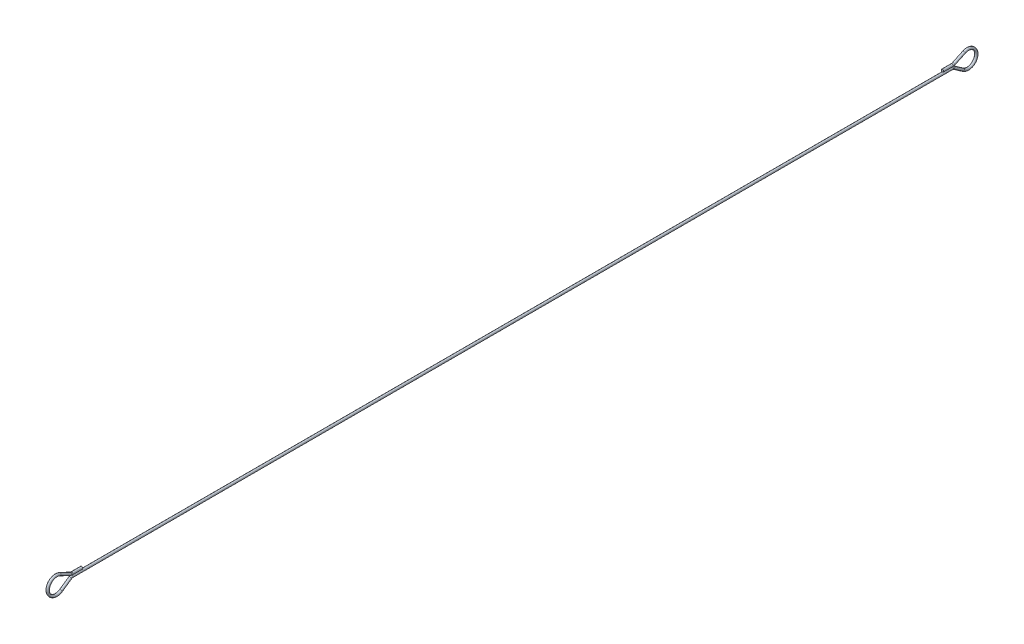
ISO-10303-21;
HEADER;
FILE_DESCRIPTION(('STEP AP214'),'2;1');
FILE_NAME('part.step','',(''),(''),'','','');
FILE_SCHEMA(('AUTOMOTIVE_DESIGN { 1 0 10303 214 1 1 1 1 }'));
ENDSEC;
DATA;
#1=APPLICATION_CONTEXT('core data for automotive mechanical design processes');
#2=APPLICATION_PROTOCOL_DEFINITION('international standard','automotive_design',2000,#1);
#3=PRODUCT_CONTEXT('',#1,'mechanical');
#4=PRODUCT('Part','Part','',(#3));
#5=PRODUCT_RELATED_PRODUCT_CATEGORY('part','',(#4));
#6=PRODUCT_DEFINITION_FORMATION('','',#4);
#7=PRODUCT_DEFINITION_CONTEXT('part definition',#1,'design');
#8=PRODUCT_DEFINITION('design','',#6,#7);
#9=PRODUCT_DEFINITION_SHAPE('','',#8);
#10=(LENGTH_UNIT() NAMED_UNIT(*) SI_UNIT(.MILLI.,.METRE.));
#11=(NAMED_UNIT(*) PLANE_ANGLE_UNIT() SI_UNIT($,.RADIAN.));
#12=(NAMED_UNIT(*) SI_UNIT($,.STERADIAN.) SOLID_ANGLE_UNIT());
#13=UNCERTAINTY_MEASURE_WITH_UNIT(LENGTH_MEASURE(1.E-05),#10,'distance_accuracy_value','');
#14=(GEOMETRIC_REPRESENTATION_CONTEXT(3) GLOBAL_UNCERTAINTY_ASSIGNED_CONTEXT((#13)) GLOBAL_UNIT_ASSIGNED_CONTEXT((#10,
#11,#12)) REPRESENTATION_CONTEXT('',''));
#15=CARTESIAN_POINT('',(0.,0.,0.));
#16=DIRECTION('',(0.,0.,1.));
#17=DIRECTION('',(1.,0.,0.));
#18=AXIS2_PLACEMENT_3D('',#15,#16,#17);
#19=CARTESIAN_POINT('',(0.,3.20000000000001,565.189079713669));
#20=DIRECTION('',(0.,0.,-1.));
#21=DIRECTION('',(1.,0.,0.));
#22=AXIS2_PLACEMENT_3D('',#19,#20,#21);
#23=PLANE('',#22);
#24=CARTESIAN_POINT('',(0.,3.20000000000001,565.189079713669));
#25=DIRECTION('',(0.,0.,-1.));
#26=DIRECTION('',(1.,0.,0.));
#27=AXIS2_PLACEMENT_3D('',#24,#25,#26);
#28=CIRCLE('',#27,1.5875);
#29=CARTESIAN_POINT('',(1.58749999999999,3.20000000000001,565.189079713669));
#30=VERTEX_POINT('',#29);
#31=EDGE_CURVE('E10',#30,#30,#28,.T.);
#32=ORIENTED_EDGE('',*,*,#31,.T.);
#33=EDGE_LOOP('',(#32));
#34=FACE_BOUND('',#33,.T.);
#35=ADVANCED_FACE('F38',(#34),#23,.T.);
#36=CARTESIAN_POINT('',(0.,0.,0.));
#37=DIRECTION('',(0.,0.,1.));
#38=DIRECTION('',(0.,-1.,0.));
#39=AXIS2_PLACEMENT_3D('',#36,#37,#38);
#40=CYLINDRICAL_SURFACE('',#39,1.5875);
#41=CARTESIAN_POINT('',(0.,-1.04083408558608E-13,577.889079713669));
#42=DIRECTION('',(0.,0.,1.));
#43=DIRECTION('',(1.,0.,0.));
#44=AXIS2_PLACEMENT_3D('',#41,#42,#43);
#45=CIRCLE('',#44,1.5875);
#46=CARTESIAN_POINT('',(0.,1.58749999999989,577.889079713669));
#47=VERTEX_POINT('',#46);
#48=EDGE_CURVE('E73',#47,#47,#45,.T.);
#49=ORIENTED_EDGE('',*,*,#48,.F.);
#50=EDGE_LOOP('',(#49));
#51=FACE_BOUND('',#50,.T.);
#52=CARTESIAN_POINT('',(0.,-1.04083408558608E-13,-577.889079713669));
#53=DIRECTION('',(0.,0.,1.));
#54=DIRECTION('',(1.,0.,0.));
#55=AXIS2_PLACEMENT_3D('',#52,#53,#54);
#56=CIRCLE('',#55,1.5875);
#57=CARTESIAN_POINT('',(0.,1.58749999999989,-577.889079713669));
#58=VERTEX_POINT('',#57);
#59=EDGE_CURVE('E101',#58,#58,#56,.F.);
#60=ORIENTED_EDGE('',*,*,#59,.F.);
#61=EDGE_LOOP('',(#60));
#62=FACE_BOUND('',#61,.T.);
#63=ADVANCED_FACE('F110',(#51,#62),#40,.T.);
#64=CARTESIAN_POINT('',(0.,-3.17500000000003,577.889079713669));
#65=DIRECTION('',(1.,0.,0.));
#66=DIRECTION('',(0.,0.,-1.));
#67=AXIS2_PLACEMENT_3D('',#64,#65,#66);
#68=TOROIDAL_SURFACE('',#67,3.17499999999993,1.5875);
#69=CARTESIAN_POINT('',(0.,-0.567642289303425,579.700794583197));
#70=DIRECTION('',(0.,-0.570618856544406,0.821215026991077));
#71=DIRECTION('',(1.,0.,0.));
#72=AXIS2_PLACEMENT_3D('',#69,#70,#71);
#73=CIRCLE('',#72,1.5875);
#74=CARTESIAN_POINT('',(0.,0.736036566044739,580.606652017962));
#75=VERTEX_POINT('',#74);
#76=EDGE_CURVE('E69',#75,#75,#73,.T.);
#77=CARTESIAN_POINT('',(0.,-3.17500000000003,577.889079713669));
#78=DIRECTION('',(1.,0.,0.));
#79=DIRECTION('',(0.,0.,-1.));
#80=AXIS2_PLACEMENT_3D('',#77,#78,#79);
#81=CIRCLE('',#80,4.76249999999993);
#82=EDGE_CURVE('',#47,#75,#81,.T.);
#83=ORIENTED_EDGE('',*,*,#48,.T.);
#84=ORIENTED_EDGE('',*,*,#76,.F.);
#85=ORIENTED_EDGE('',*,*,#82,.T.);
#86=ORIENTED_EDGE('',*,*,#82,.F.);
#87=EDGE_LOOP('',(#83,#85,#84,#86));
#88=FACE_BOUND('',#87,.T.);
#89=ADVANCED_FACE('F112',(#88),#68,.T.);
#90=CARTESIAN_POINT('',(0.,-0.567642289303429,579.700794583197));
#91=DIRECTION('',(0.,-0.57061885654442,0.821215026991067));
#92=DIRECTION('',(0.,-0.821215026991067,-0.57061885654442));
#93=AXIS2_PLACEMENT_3D('',#90,#91,#92);
#94=CYLINDRICAL_SURFACE('',#93,1.5875);
#95=CARTESIAN_POINT('',(0.,-9.17594890499196,592.089573307687));
#96=DIRECTION('',(0.,-0.57061885654442,0.821215026991067));
#97=DIRECTION('',(1.,0.,0.));
#98=AXIS2_PLACEMENT_3D('',#95,#96,#97);
#99=CIRCLE('',#98,1.5875);
#100=CARTESIAN_POINT('',(0.,-10.4796277603402,591.183715872922));
#101=VERTEX_POINT('',#100);
#102=EDGE_CURVE('E65',#101,#101,#99,.T.);
#103=ORIENTED_EDGE('',*,*,#102,.F.);
#104=EDGE_LOOP('',(#103));
#105=FACE_BOUND('',#104,.T.);
#106=ORIENTED_EDGE('',*,*,#76,.T.);
#107=EDGE_LOOP('',(#106));
#108=FACE_BOUND('',#107,.T.);
#109=ADVANCED_FACE('F119',(#105,#108),#94,.T.);
#110=CARTESIAN_POINT('',(0.,0.,598.465454532195));
#111=DIRECTION('',(-1.,0.,0.));
#112=DIRECTION('',(0.,0.,1.));
#113=AXIS2_PLACEMENT_3D('',#110,#111,#112);
#114=TOROIDAL_SURFACE('',#113,11.1736251814736,1.5875);
#115=CARTESIAN_POINT('',(0.,10.1096495644325,593.706790288898));
#116=DIRECTION('',(0.,-0.425883647071573,-0.904777939141432));
#117=DIRECTION('',(1.,0.,0.));
#118=AXIS2_PLACEMENT_3D('',#115,#116,#117);
#119=CIRCLE('',#118,1.5875);
#120=CARTESIAN_POINT('',(0.,11.5459845428194,593.030699999172));
#121=VERTEX_POINT('',#120);
#122=EDGE_CURVE('E59',#121,#121,#119,.T.);
#123=CARTESIAN_POINT('',(0.,0.,598.465454532195));
#124=DIRECTION('',(-1.,0.,0.));
#125=DIRECTION('',(0.,0.,1.));
#126=AXIS2_PLACEMENT_3D('',#123,#124,#125);
#127=CIRCLE('',#126,12.7611251814736);
#128=EDGE_CURVE('',#101,#121,#127,.T.);
#129=ORIENTED_EDGE('',*,*,#102,.T.);
#130=ORIENTED_EDGE('',*,*,#122,.F.);
#131=ORIENTED_EDGE('',*,*,#128,.T.);
#132=ORIENTED_EDGE('',*,*,#128,.F.);
#133=EDGE_LOOP('',(#129,#131,#130,#132));
#134=FACE_BOUND('',#133,.T.);
#135=ADVANCED_FACE('F141',(#134),#114,.T.);
#136=CARTESIAN_POINT('',(0.,10.1096495644325,593.706790288898));
#137=DIRECTION('',(0.,-0.425883647071573,-0.904777939141432));
#138=DIRECTION('',(0.,0.904777939141432,-0.425883647071573));
#139=AXIS2_PLACEMENT_3D('',#136,#137,#138);
#140=CYLINDRICAL_SURFACE('',#139,1.5875);
#141=CARTESIAN_POINT('',(0.,3.68480577500471,580.057388713902));
#142=DIRECTION('',(0.,-0.425883647071573,-0.904777939141432));
#143=DIRECTION('',(1.,0.,0.));
#144=AXIS2_PLACEMENT_3D('',#141,#142,#143);
#145=CIRCLE('',#144,1.5875);
#146=CARTESIAN_POINT('',(0.,2.24847079661767,580.733479003628));
#147=VERTEX_POINT('',#146);
#148=EDGE_CURVE('E52',#147,#147,#145,.T.);
#149=ORIENTED_EDGE('',*,*,#148,.F.);
#150=EDGE_LOOP('',(#149));
#151=FACE_BOUND('',#150,.T.);
#152=ORIENTED_EDGE('',*,*,#122,.T.);
#153=EDGE_LOOP('',(#152));
#154=FACE_BOUND('',#153,.T.);
#155=ADVANCED_FACE('F135',(#151,#154),#140,.T.);
#156=CARTESIAN_POINT('',(0.,8.2913178168322,577.889079713669));
#157=DIRECTION('',(1.,0.,0.));
#158=DIRECTION('',(0.,0.,-1.));
#159=AXIS2_PLACEMENT_3D('',#156,#157,#158);
#160=TOROIDAL_SURFACE('',#159,5.09131781683218,1.5875);
#161=CARTESIAN_POINT('',(0.,3.20000000000002,577.889079713669));
#162=DIRECTION('',(0.,0.,-1.));
#163=DIRECTION('',(1.,0.,0.));
#164=AXIS2_PLACEMENT_3D('',#161,#162,#163);
#165=CIRCLE('',#164,1.5875);
#166=CARTESIAN_POINT('',(0.,1.61250000000002,577.889079713669));
#167=VERTEX_POINT('',#166);
#168=EDGE_CURVE('E45',#167,#167,#165,.T.);
#169=CARTESIAN_POINT('',(0.,8.2913178168322,577.889079713669));
#170=DIRECTION('',(1.,0.,0.));
#171=DIRECTION('',(0.,0.,-1.));
#172=AXIS2_PLACEMENT_3D('',#169,#170,#171);
#173=CIRCLE('',#172,6.67881781683217);
#174=EDGE_CURVE('',#147,#167,#173,.T.);
#175=ORIENTED_EDGE('',*,*,#148,.T.);
#176=ORIENTED_EDGE('',*,*,#168,.F.);
#177=ORIENTED_EDGE('',*,*,#174,.T.);
#178=ORIENTED_EDGE('',*,*,#174,.F.);
#179=EDGE_LOOP('',(#175,#177,#176,#178));
#180=FACE_BOUND('',#179,.T.);
#181=ADVANCED_FACE('F128',(#180),#160,.T.);
#182=CARTESIAN_POINT('',(0.,3.20000000000001,577.889079713669));
#183=DIRECTION('',(0.,0.,-1.));
#184=DIRECTION('',(0.,1.,0.));
#185=AXIS2_PLACEMENT_3D('',#182,#183,#184);
#186=CYLINDRICAL_SURFACE('',#185,1.5875);
#187=ORIENTED_EDGE('',*,*,#31,.F.);
#188=EDGE_LOOP('',(#187));
#189=FACE_BOUND('',#188,.T.);
#190=ORIENTED_EDGE('',*,*,#168,.T.);
#191=EDGE_LOOP('',(#190));
#192=FACE_BOUND('',#191,.T.);
#193=ADVANCED_FACE('F125',(#189,#192),#186,.T.);
#194=CARTESIAN_POINT('',(0.,3.20000000000001,-565.189079713669));
#195=DIRECTION('',(0.,0.,1.));
#196=DIRECTION('',(1.,0.,0.));
#197=AXIS2_PLACEMENT_3D('',#194,#195,#196);
#198=PLANE('',#197);
#199=CARTESIAN_POINT('',(0.,3.20000000000001,-565.189079713669));
#200=DIRECTION('',(0.,0.,-1.));
#201=DIRECTION('',(1.,0.,0.));
#202=AXIS2_PLACEMENT_3D('',#199,#200,#201);
#203=CIRCLE('',#202,1.5875);
#204=CARTESIAN_POINT('',(1.58750000000004,3.20000000000001,-565.189079713669));
#205=VERTEX_POINT('',#204);
#206=EDGE_CURVE('E77',#205,#205,#203,.F.);
#207=ORIENTED_EDGE('',*,*,#206,.T.);
#208=EDGE_LOOP('',(#207));
#209=FACE_BOUND('',#208,.T.);
#210=ADVANCED_FACE('F127',(#209),#198,.T.);
#211=CARTESIAN_POINT('',(0.,-3.17500000000003,-577.889079713669));
#212=DIRECTION('',(-1.,0.,0.));
#213=DIRECTION('',(0.,0.,1.));
#214=AXIS2_PLACEMENT_3D('',#211,#212,#213);
#215=TOROIDAL_SURFACE('',#214,3.17499999999993,1.5875);
#216=CARTESIAN_POINT('',(0.,-0.567642289303425,-579.700794583197));
#217=DIRECTION('',(0.,0.570618856544406,0.821215026991077));
#218=DIRECTION('',(1.,0.,0.));
#219=AXIS2_PLACEMENT_3D('',#216,#217,#218);
#220=CIRCLE('',#219,1.5875);
#221=CARTESIAN_POINT('',(0.,0.736036566044894,-580.606652017961));
#222=VERTEX_POINT('',#221);
#223=EDGE_CURVE('E97',#222,#222,#220,.F.);
#224=CARTESIAN_POINT('',(0.,-3.17500000000003,-577.889079713669));
#225=DIRECTION('',(-1.,0.,0.));
#226=DIRECTION('',(0.,0.,1.));
#227=AXIS2_PLACEMENT_3D('',#224,#225,#226);
#228=CIRCLE('',#227,4.76249999999993);
#229=EDGE_CURVE('',#58,#222,#228,.T.);
#230=ORIENTED_EDGE('',*,*,#59,.T.);
#231=ORIENTED_EDGE('',*,*,#223,.F.);
#232=ORIENTED_EDGE('',*,*,#229,.T.);
#233=ORIENTED_EDGE('',*,*,#229,.F.);
#234=EDGE_LOOP('',(#230,#232,#231,#233));
#235=FACE_BOUND('',#234,.T.);
#236=ADVANCED_FACE('F108',(#235),#215,.T.);
#237=CARTESIAN_POINT('',(0.,-0.567642289303429,-579.700794583197));
#238=DIRECTION('',(0.,-0.57061885654442,-0.821215026991067));
#239=DIRECTION('',(0.,0.821215026991067,-0.57061885654442));
#240=AXIS2_PLACEMENT_3D('',#237,#238,#239);
#241=CYLINDRICAL_SURFACE('',#240,1.5875);
#242=CARTESIAN_POINT('',(0.,-9.17594890499196,-592.089573307687));
#243=DIRECTION('',(0.,0.57061885654442,0.821215026991067));
#244=DIRECTION('',(1.,0.,0.));
#245=AXIS2_PLACEMENT_3D('',#242,#243,#244);
#246=CIRCLE('',#245,1.5875);
#247=CARTESIAN_POINT('',(0.,-10.4796277603404,-591.183715872922));
#248=VERTEX_POINT('',#247);
#249=EDGE_CURVE('E93',#248,#248,#246,.F.);
#250=ORIENTED_EDGE('',*,*,#249,.F.);
#251=EDGE_LOOP('',(#250));
#252=FACE_BOUND('',#251,.T.);
#253=ORIENTED_EDGE('',*,*,#223,.T.);
#254=EDGE_LOOP('',(#253));
#255=FACE_BOUND('',#254,.T.);
#256=ADVANCED_FACE('F189',(#252,#255),#241,.T.);
#257=CARTESIAN_POINT('',(0.,0.,-598.465454532195));
#258=DIRECTION('',(1.,0.,0.));
#259=DIRECTION('',(0.,0.,-1.));
#260=AXIS2_PLACEMENT_3D('',#257,#258,#259);
#261=TOROIDAL_SURFACE('',#260,11.1736251814736,1.5875);
#262=CARTESIAN_POINT('',(0.,10.1096495644325,-593.706790288898));
#263=DIRECTION('',(0.,0.425883647071573,-0.904777939141432));
#264=DIRECTION('',(1.,0.,0.));
#265=AXIS2_PLACEMENT_3D('',#262,#263,#264);
#266=CIRCLE('',#265,1.5875);
#267=CARTESIAN_POINT('',(0.,11.5459845428195,-593.030699999172));
#268=VERTEX_POINT('',#267);
#269=EDGE_CURVE('E89',#268,#268,#266,.F.);
#270=CARTESIAN_POINT('',(0.,0.,-598.465454532195));
#271=DIRECTION('',(1.,0.,0.));
#272=DIRECTION('',(0.,0.,-1.));
#273=AXIS2_PLACEMENT_3D('',#270,#271,#272);
#274=CIRCLE('',#273,12.7611251814736);
#275=EDGE_CURVE('',#248,#268,#274,.T.);
#276=ORIENTED_EDGE('',*,*,#249,.T.);
#277=ORIENTED_EDGE('',*,*,#269,.F.);
#278=ORIENTED_EDGE('',*,*,#275,.T.);
#279=ORIENTED_EDGE('',*,*,#275,.F.);
#280=EDGE_LOOP('',(#276,#278,#277,#279));
#281=FACE_BOUND('',#280,.T.);
#282=ADVANCED_FACE('F199',(#281),#261,.T.);
#283=CARTESIAN_POINT('',(0.,10.1096495644325,-593.706790288898));
#284=DIRECTION('',(0.,-0.425883647071573,0.904777939141432));
#285=DIRECTION('',(0.,-0.904777939141432,-0.425883647071573));
#286=AXIS2_PLACEMENT_3D('',#283,#284,#285);
#287=CYLINDRICAL_SURFACE('',#286,1.5875);
#288=CARTESIAN_POINT('',(0.,3.68480577500471,-580.057388713902));
#289=DIRECTION('',(0.,0.425883647071573,-0.904777939141432));
#290=DIRECTION('',(1.,0.,0.));
#291=AXIS2_PLACEMENT_3D('',#288,#289,#290);
#292=CIRCLE('',#291,1.5875);
#293=CARTESIAN_POINT('',(0.,2.24847079661767,-580.733479003628));
#294=VERTEX_POINT('',#293);
#295=EDGE_CURVE('E85',#294,#294,#292,.F.);
#296=ORIENTED_EDGE('',*,*,#295,.F.);
#297=EDGE_LOOP('',(#296));
#298=FACE_BOUND('',#297,.T.);
#299=ORIENTED_EDGE('',*,*,#269,.T.);
#300=EDGE_LOOP('',(#299));
#301=FACE_BOUND('',#300,.T.);
#302=ADVANCED_FACE('F209',(#298,#301),#287,.T.);
#303=CARTESIAN_POINT('',(0.,8.2913178168322,-577.889079713669));
#304=DIRECTION('',(-1.,0.,0.));
#305=DIRECTION('',(0.,0.,1.));
#306=AXIS2_PLACEMENT_3D('',#303,#304,#305);
#307=TOROIDAL_SURFACE('',#306,5.09131781683218,1.5875);
#308=CARTESIAN_POINT('',(0.,3.20000000000002,-577.889079713669));
#309=DIRECTION('',(0.,0.,-1.));
#310=DIRECTION('',(1.,0.,0.));
#311=AXIS2_PLACEMENT_3D('',#308,#309,#310);
#312=CIRCLE('',#311,1.5875);
#313=CARTESIAN_POINT('',(0.,1.61250000000002,-577.889079713669));
#314=VERTEX_POINT('',#313);
#315=EDGE_CURVE('E81',#314,#314,#312,.F.);
#316=CARTESIAN_POINT('',(0.,8.2913178168322,-577.889079713669));
#317=DIRECTION('',(-1.,0.,0.));
#318=DIRECTION('',(0.,0.,1.));
#319=AXIS2_PLACEMENT_3D('',#316,#317,#318);
#320=CIRCLE('',#319,6.67881781683217);
#321=EDGE_CURVE('',#294,#314,#320,.T.);
#322=ORIENTED_EDGE('',*,*,#295,.T.);
#323=ORIENTED_EDGE('',*,*,#315,.F.);
#324=ORIENTED_EDGE('',*,*,#321,.T.);
#325=ORIENTED_EDGE('',*,*,#321,.F.);
#326=EDGE_LOOP('',(#322,#324,#323,#325));
#327=FACE_BOUND('',#326,.T.);
#328=ADVANCED_FACE('F219',(#327),#307,.T.);
#329=CARTESIAN_POINT('',(0.,3.20000000000001,-577.889079713669));
#330=DIRECTION('',(0.,0.,1.));
#331=DIRECTION('',(0.,-1.,0.));
#332=AXIS2_PLACEMENT_3D('',#329,#330,#331);
#333=CYLINDRICAL_SURFACE('',#332,1.5875);
#334=ORIENTED_EDGE('',*,*,#206,.F.);
#335=EDGE_LOOP('',(#334));
#336=FACE_BOUND('',#335,.T.);
#337=ORIENTED_EDGE('',*,*,#315,.T.);
#338=EDGE_LOOP('',(#337));
#339=FACE_BOUND('',#338,.T.);
#340=ADVANCED_FACE('F122',(#336,#339),#333,.T.);
#341=CLOSED_SHELL('',(#35,#63,#89,#109,#135,#155,#181,#193,#210,#236,#256,#282,#302,#328,#340));
#342=MANIFOLD_SOLID_BREP('B2',#341);
#343=ADVANCED_BREP_SHAPE_REPRESENTATION('',(#18,#342),#14);
#344=SHAPE_DEFINITION_REPRESENTATION(#9,#343);
ENDSEC;
END-ISO-10303-21;
